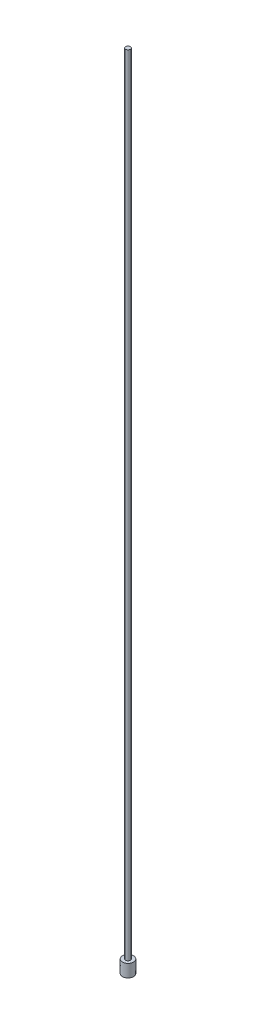
ISO-10303-21;
HEADER;
FILE_DESCRIPTION(('STEP AP214'),'2;1');
FILE_NAME('part.step','',(''),(''),'','','');
FILE_SCHEMA(('AUTOMOTIVE_DESIGN { 1 0 10303 214 1 1 1 1 }'));
ENDSEC;
DATA;
#1=APPLICATION_CONTEXT('core data for automotive mechanical design processes');
#2=APPLICATION_PROTOCOL_DEFINITION('international standard','automotive_design',2000,#1);
#3=PRODUCT_CONTEXT('',#1,'mechanical');
#4=PRODUCT('Part','Part','',(#3));
#5=PRODUCT_RELATED_PRODUCT_CATEGORY('part','',(#4));
#6=PRODUCT_DEFINITION_FORMATION('','',#4);
#7=PRODUCT_DEFINITION_CONTEXT('part definition',#1,'design');
#8=PRODUCT_DEFINITION('design','',#6,#7);
#9=PRODUCT_DEFINITION_SHAPE('','',#8);
#10=(LENGTH_UNIT() NAMED_UNIT(*) SI_UNIT(.MILLI.,.METRE.));
#11=(NAMED_UNIT(*) PLANE_ANGLE_UNIT() SI_UNIT($,.RADIAN.));
#12=(NAMED_UNIT(*) SI_UNIT($,.STERADIAN.) SOLID_ANGLE_UNIT());
#13=UNCERTAINTY_MEASURE_WITH_UNIT(LENGTH_MEASURE(1.E-05),#10,'distance_accuracy_value','');
#14=(GEOMETRIC_REPRESENTATION_CONTEXT(3) GLOBAL_UNCERTAINTY_ASSIGNED_CONTEXT((#13)) GLOBAL_UNIT_ASSIGNED_CONTEXT((#10,
#11,#12)) REPRESENTATION_CONTEXT('',''));
#15=CARTESIAN_POINT('',(0.,0.,0.));
#16=DIRECTION('',(0.,0.,1.));
#17=DIRECTION('',(1.,0.,0.));
#18=AXIS2_PLACEMENT_3D('',#15,#16,#17);
#19=CARTESIAN_POINT('',(0.,8.,0.));
#20=DIRECTION('',(0.,1.,0.));
#21=DIRECTION('',(0.,0.,1.));
#22=AXIS2_PLACEMENT_3D('',#19,#20,#21);
#23=PLANE('',#22);
#24=CARTESIAN_POINT('',(0.,8.,0.));
#25=DIRECTION('',(0.,1.,0.));
#26=DIRECTION('',(0.,0.,1.));
#27=AXIS2_PLACEMENT_3D('',#24,#25,#26);
#28=CIRCLE('',#27,3.5);
#29=CARTESIAN_POINT('',(0.,8.,3.5));
#30=VERTEX_POINT('',#29);
#31=EDGE_CURVE('E10',#30,#30,#28,.T.);
#32=ORIENTED_EDGE('',*,*,#31,.T.);
#33=EDGE_LOOP('',(#32));
#34=FACE_BOUND('',#33,.T.);
#35=CARTESIAN_POINT('',(0.,8.,0.));
#36=DIRECTION('',(0.,1.,0.));
#37=DIRECTION('',(0.,0.,1.));
#38=AXIS2_PLACEMENT_3D('',#35,#36,#37);
#39=CIRCLE('',#38,1.5);
#40=CARTESIAN_POINT('',(0.,8.,1.5));
#41=VERTEX_POINT('',#40);
#42=EDGE_CURVE('E44',#41,#41,#39,.T.);
#43=ORIENTED_EDGE('',*,*,#42,.F.);
#44=EDGE_LOOP('',(#43));
#45=FACE_BOUND('',#44,.T.);
#46=ADVANCED_FACE('F31',(#34,#45),#23,.T.);
#47=CARTESIAN_POINT('',(0.,8.,0.));
#48=DIRECTION('',(0.,-1.,0.));
#49=DIRECTION('',(0.,0.,-1.));
#50=AXIS2_PLACEMENT_3D('',#47,#48,#49);
#51=CYLINDRICAL_SURFACE('',#50,3.5);
#52=ORIENTED_EDGE('',*,*,#31,.F.);
#53=EDGE_LOOP('',(#52));
#54=FACE_BOUND('',#53,.T.);
#55=CARTESIAN_POINT('',(0.,0.,0.));
#56=DIRECTION('',(0.,1.,0.));
#57=DIRECTION('',(0.,0.,1.));
#58=AXIS2_PLACEMENT_3D('',#55,#56,#57);
#59=CIRCLE('',#58,3.5);
#60=CARTESIAN_POINT('',(0.,0.,3.5));
#61=VERTEX_POINT('',#60);
#62=EDGE_CURVE('E35',#61,#61,#59,.T.);
#63=ORIENTED_EDGE('',*,*,#62,.T.);
#64=EDGE_LOOP('',(#63));
#65=FACE_BOUND('',#64,.T.);
#66=ADVANCED_FACE('F33',(#54,#65),#51,.T.);
#67=CARTESIAN_POINT('',(0.,0.,0.));
#68=DIRECTION('',(0.,1.,0.));
#69=DIRECTION('',(0.,0.,1.));
#70=AXIS2_PLACEMENT_3D('',#67,#68,#69);
#71=PLANE('',#70);
#72=ORIENTED_EDGE('',*,*,#62,.F.);
#73=EDGE_LOOP('',(#72));
#74=FACE_BOUND('',#73,.T.);
#75=ADVANCED_FACE('F55',(#74),#71,.F.);
#76=CARTESIAN_POINT('',(0.,508.,0.));
#77=DIRECTION('',(0.,-1.,0.));
#78=DIRECTION('',(0.,0.,-1.));
#79=AXIS2_PLACEMENT_3D('',#76,#77,#78);
#80=CYLINDRICAL_SURFACE('',#79,1.5);
#81=CARTESIAN_POINT('',(0.,508.,0.));
#82=DIRECTION('',(0.,1.,0.));
#83=DIRECTION('',(0.,0.,1.));
#84=AXIS2_PLACEMENT_3D('',#81,#82,#83);
#85=CIRCLE('',#84,1.5);
#86=CARTESIAN_POINT('',(0.,508.,1.5));
#87=VERTEX_POINT('',#86);
#88=EDGE_CURVE('E42',#87,#87,#85,.T.);
#89=ORIENTED_EDGE('',*,*,#88,.F.);
#90=EDGE_LOOP('',(#89));
#91=FACE_BOUND('',#90,.T.);
#92=ORIENTED_EDGE('',*,*,#42,.T.);
#93=EDGE_LOOP('',(#92));
#94=FACE_BOUND('',#93,.T.);
#95=ADVANCED_FACE('F52',(#91,#94),#80,.T.);
#96=CARTESIAN_POINT('',(0.,508.,0.));
#97=DIRECTION('',(0.,1.,0.));
#98=DIRECTION('',(0.,0.,1.));
#99=AXIS2_PLACEMENT_3D('',#96,#97,#98);
#100=PLANE('',#99);
#101=ORIENTED_EDGE('',*,*,#88,.T.);
#102=EDGE_LOOP('',(#101));
#103=FACE_BOUND('',#102,.T.);
#104=ADVANCED_FACE('F50',(#103),#100,.T.);
#105=CLOSED_SHELL('',(#46,#66,#75,#95,#104));
#106=MANIFOLD_SOLID_BREP('B2',#105);
#107=ADVANCED_BREP_SHAPE_REPRESENTATION('',(#18,#106),#14);
#108=SHAPE_DEFINITION_REPRESENTATION(#9,#107);
ENDSEC;
END-ISO-10303-21;
